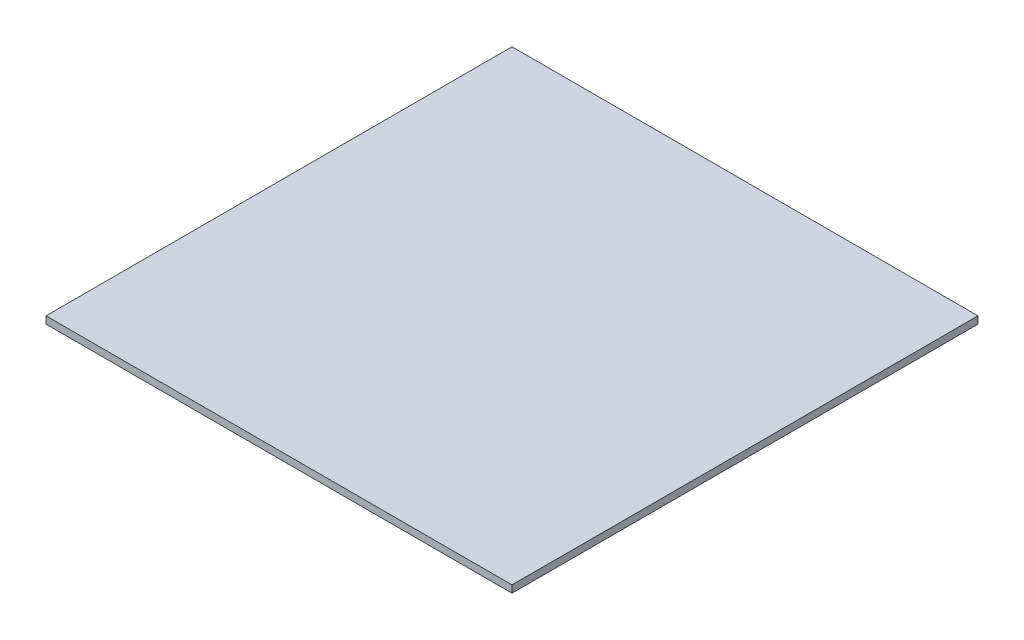
ISO-10303-21;
HEADER;
FILE_DESCRIPTION(('STEP AP214'),'2;1');
FILE_NAME('part.step','',(''),(''),'','','');
FILE_SCHEMA(('AUTOMOTIVE_DESIGN { 1 0 10303 214 1 1 1 1 }'));
ENDSEC;
DATA;
#1=APPLICATION_CONTEXT('core data for automotive mechanical design processes');
#2=APPLICATION_PROTOCOL_DEFINITION('international standard','automotive_design',2000,#1);
#3=PRODUCT_CONTEXT('',#1,'mechanical');
#4=PRODUCT('Part','Part','',(#3));
#5=PRODUCT_RELATED_PRODUCT_CATEGORY('part','',(#4));
#6=PRODUCT_DEFINITION_FORMATION('','',#4);
#7=PRODUCT_DEFINITION_CONTEXT('part definition',#1,'design');
#8=PRODUCT_DEFINITION('design','',#6,#7);
#9=PRODUCT_DEFINITION_SHAPE('','',#8);
#10=(LENGTH_UNIT() NAMED_UNIT(*) SI_UNIT(.MILLI.,.METRE.));
#11=(NAMED_UNIT(*) PLANE_ANGLE_UNIT() SI_UNIT($,.RADIAN.));
#12=(NAMED_UNIT(*) SI_UNIT($,.STERADIAN.) SOLID_ANGLE_UNIT());
#13=UNCERTAINTY_MEASURE_WITH_UNIT(LENGTH_MEASURE(1.E-05),#10,'distance_accuracy_value','');
#14=(GEOMETRIC_REPRESENTATION_CONTEXT(3) GLOBAL_UNCERTAINTY_ASSIGNED_CONTEXT((#13)) GLOBAL_UNIT_ASSIGNED_CONTEXT((#10,
#11,#12)) REPRESENTATION_CONTEXT('',''));
#15=CARTESIAN_POINT('',(0.,0.,0.));
#16=DIRECTION('',(0.,0.,1.));
#17=DIRECTION('',(1.,0.,0.));
#18=AXIS2_PLACEMENT_3D('',#15,#16,#17);
#19=CARTESIAN_POINT('',(-28044.537705685,466.,-452.724341639257));
#20=DIRECTION('',(1.,0.,0.));
#21=DIRECTION('',(0.,0.,-1.));
#22=AXIS2_PLACEMENT_3D('',#19,#20,#21);
#23=PLANE('',#22);
#24=DIRECTION('',(0.,0.,1.));
#25=VECTOR('',#24,1.);
#26=CARTESIAN_POINT('',(-28044.537705685,0.,-452.724341639257));
#27=LINE('',#26,#25);
#28=CARTESIAN_POINT('',(-28044.537705685,0.,-452.724341639257));
#29=VERTEX_POINT('',#28);
#30=CARTESIAN_POINT('',(-28044.537705685,0.,29547.2756583607));
#31=VERTEX_POINT('',#30);
#32=EDGE_CURVE('E96',#29,#31,#27,.T.);
#33=ORIENTED_EDGE('',*,*,#32,.T.);
#34=DIRECTION('',(0.,-1.,0.));
#35=VECTOR('',#34,1.);
#36=CARTESIAN_POINT('',(-28044.537705685,466.,29547.2756583607));
#37=LINE('',#36,#35);
#38=CARTESIAN_POINT('',(-28044.537705685,466.,29547.2756583607));
#39=VERTEX_POINT('',#38);
#40=EDGE_CURVE('E11',#39,#31,#37,.T.);
#41=ORIENTED_EDGE('',*,*,#40,.F.);
#42=DIRECTION('',(0.,0.,1.));
#43=VECTOR('',#42,1.);
#44=CARTESIAN_POINT('',(-28044.537705685,466.,-452.724341639257));
#45=LINE('',#44,#43);
#46=CARTESIAN_POINT('',(-28044.537705685,466.,-452.724341639257));
#47=VERTEX_POINT('',#46);
#48=EDGE_CURVE('E84',#47,#39,#45,.T.);
#49=ORIENTED_EDGE('',*,*,#48,.F.);
#50=DIRECTION('',(0.,-1.,0.));
#51=VECTOR('',#50,1.);
#52=CARTESIAN_POINT('',(-28044.537705685,466.,-452.724341639257));
#53=LINE('',#52,#51);
#54=EDGE_CURVE('E92',#47,#29,#53,.T.);
#55=ORIENTED_EDGE('',*,*,#54,.T.);
#56=EDGE_LOOP('',(#33,#41,#49,#55));
#57=FACE_BOUND('',#56,.T.);
#58=ADVANCED_FACE('F33',(#57),#23,.F.);
#59=CARTESIAN_POINT('',(-28044.537705685,466.,29547.2756583607));
#60=DIRECTION('',(0.,0.,-1.));
#61=DIRECTION('',(-1.,0.,0.));
#62=AXIS2_PLACEMENT_3D('',#59,#60,#61);
#63=PLANE('',#62);
#64=DIRECTION('',(1.,0.,0.));
#65=VECTOR('',#64,1.);
#66=CARTESIAN_POINT('',(-28044.537705685,0.,29547.2756583607));
#67=LINE('',#66,#65);
#68=CARTESIAN_POINT('',(1955.462294315,0.,29547.2756583607));
#69=VERTEX_POINT('',#68);
#70=EDGE_CURVE('E88',#31,#69,#67,.T.);
#71=ORIENTED_EDGE('',*,*,#70,.T.);
#72=DIRECTION('',(0.,-1.,0.));
#73=VECTOR('',#72,1.);
#74=CARTESIAN_POINT('',(1955.462294315,466.,29547.2756583607));
#75=LINE('',#74,#73);
#76=CARTESIAN_POINT('',(1955.462294315,466.,29547.2756583607));
#77=VERTEX_POINT('',#76);
#78=EDGE_CURVE('E41',#77,#69,#75,.T.);
#79=ORIENTED_EDGE('',*,*,#78,.F.);
#80=DIRECTION('',(1.,0.,0.));
#81=VECTOR('',#80,1.);
#82=CARTESIAN_POINT('',(-28044.537705685,466.,29547.2756583607));
#83=LINE('',#82,#81);
#84=EDGE_CURVE('E79',#39,#77,#83,.T.);
#85=ORIENTED_EDGE('',*,*,#84,.F.);
#86=ORIENTED_EDGE('',*,*,#40,.T.);
#87=EDGE_LOOP('',(#71,#79,#85,#86));
#88=FACE_BOUND('',#87,.T.);
#89=ADVANCED_FACE('F87',(#88),#63,.F.);
#90=CARTESIAN_POINT('',(1955.462294315,466.,-452.724341639257));
#91=DIRECTION('',(-1.,0.,0.));
#92=DIRECTION('',(0.,0.,1.));
#93=AXIS2_PLACEMENT_3D('',#90,#91,#92);
#94=PLANE('',#93);
#95=DIRECTION('',(0.,0.,-1.));
#96=VECTOR('',#95,1.);
#97=CARTESIAN_POINT('',(1955.462294315,0.,-452.724341639257));
#98=LINE('',#97,#96);
#99=CARTESIAN_POINT('',(1955.462294315,0.,-452.724341639257));
#100=VERTEX_POINT('',#99);
#101=EDGE_CURVE('E66',#69,#100,#98,.T.);
#102=ORIENTED_EDGE('',*,*,#101,.T.);
#103=DIRECTION('',(0.,-1.,0.));
#104=VECTOR('',#103,1.);
#105=CARTESIAN_POINT('',(1955.462294315,466.,-452.724341639257));
#106=LINE('',#105,#104);
#107=CARTESIAN_POINT('',(1955.462294315,466.,-452.724341639257));
#108=VERTEX_POINT('',#107);
#109=EDGE_CURVE('E89',#108,#100,#106,.T.);
#110=ORIENTED_EDGE('',*,*,#109,.F.);
#111=DIRECTION('',(0.,0.,-1.));
#112=VECTOR('',#111,1.);
#113=CARTESIAN_POINT('',(1955.462294315,466.,-452.724341639257));
#114=LINE('',#113,#112);
#115=EDGE_CURVE('E82',#77,#108,#114,.T.);
#116=ORIENTED_EDGE('',*,*,#115,.F.);
#117=ORIENTED_EDGE('',*,*,#78,.T.);
#118=EDGE_LOOP('',(#102,#110,#116,#117));
#119=FACE_BOUND('',#118,.T.);
#120=ADVANCED_FACE('F90',(#119),#94,.F.);
#121=CARTESIAN_POINT('',(-28044.537705685,466.,-452.724341639257));
#122=DIRECTION('',(0.,0.,1.));
#123=DIRECTION('',(1.,0.,0.));
#124=AXIS2_PLACEMENT_3D('',#121,#122,#123);
#125=PLANE('',#124);
#126=DIRECTION('',(-1.,0.,0.));
#127=VECTOR('',#126,1.);
#128=CARTESIAN_POINT('',(-28044.537705685,0.,-452.724341639257));
#129=LINE('',#128,#127);
#130=EDGE_CURVE('E72',#100,#29,#129,.T.);
#131=ORIENTED_EDGE('',*,*,#130,.T.);
#132=ORIENTED_EDGE('',*,*,#54,.F.);
#133=DIRECTION('',(-1.,0.,0.));
#134=VECTOR('',#133,1.);
#135=CARTESIAN_POINT('',(-28044.537705685,466.,-452.724341639257));
#136=LINE('',#135,#134);
#137=EDGE_CURVE('E49',#108,#47,#136,.T.);
#138=ORIENTED_EDGE('',*,*,#137,.F.);
#139=ORIENTED_EDGE('',*,*,#109,.T.);
#140=EDGE_LOOP('',(#131,#132,#138,#139));
#141=FACE_BOUND('',#140,.T.);
#142=ADVANCED_FACE('F103',(#141),#125,.F.);
#143=CARTESIAN_POINT('',(0.,466.,0.));
#144=DIRECTION('',(0.,1.,0.));
#145=DIRECTION('',(0.,0.,1.));
#146=AXIS2_PLACEMENT_3D('',#143,#144,#145);
#147=PLANE('',#146);
#148=ORIENTED_EDGE('',*,*,#48,.T.);
#149=ORIENTED_EDGE('',*,*,#84,.T.);
#150=ORIENTED_EDGE('',*,*,#115,.T.);
#151=ORIENTED_EDGE('',*,*,#137,.T.);
#152=EDGE_LOOP('',(#148,#149,#150,#151));
#153=FACE_BOUND('',#152,.T.);
#154=ADVANCED_FACE('F80',(#153),#147,.T.);
#155=CARTESIAN_POINT('',(0.,0.,0.));
#156=DIRECTION('',(0.,1.,0.));
#157=DIRECTION('',(0.,0.,1.));
#158=AXIS2_PLACEMENT_3D('',#155,#156,#157);
#159=PLANE('',#158);
#160=ORIENTED_EDGE('',*,*,#32,.F.);
#161=ORIENTED_EDGE('',*,*,#130,.F.);
#162=ORIENTED_EDGE('',*,*,#101,.F.);
#163=ORIENTED_EDGE('',*,*,#70,.F.);
#164=EDGE_LOOP('',(#160,#161,#162,#163));
#165=FACE_BOUND('',#164,.T.);
#166=ADVANCED_FACE('F106',(#165),#159,.F.);
#167=CLOSED_SHELL('',(#58,#89,#120,#142,#154,#166));
#168=MANIFOLD_SOLID_BREP('B2',#167);
#169=ADVANCED_BREP_SHAPE_REPRESENTATION('',(#18,#168),#14);
#170=SHAPE_DEFINITION_REPRESENTATION(#9,#169);
ENDSEC;
END-ISO-10303-21;
